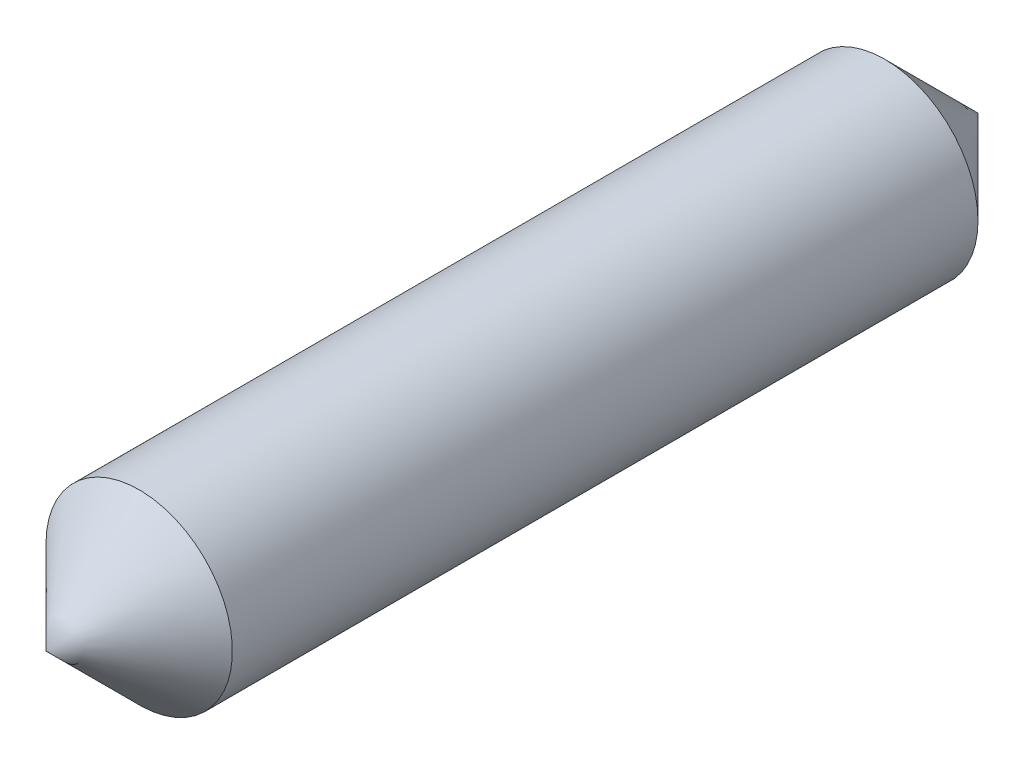
ISO-10303-21;
HEADER;
FILE_DESCRIPTION(('STEP AP214'),'2;1');
FILE_NAME('part.step','',(''),(''),'','','');
FILE_SCHEMA(('AUTOMOTIVE_DESIGN { 1 0 10303 214 1 1 1 1 }'));
ENDSEC;
DATA;
#1=APPLICATION_CONTEXT('core data for automotive mechanical design processes');
#2=APPLICATION_PROTOCOL_DEFINITION('international standard','automotive_design',2000,#1);
#3=PRODUCT_CONTEXT('',#1,'mechanical');
#4=PRODUCT('Part','Part','',(#3));
#5=PRODUCT_RELATED_PRODUCT_CATEGORY('part','',(#4));
#6=PRODUCT_DEFINITION_FORMATION('','',#4);
#7=PRODUCT_DEFINITION_CONTEXT('part definition',#1,'design');
#8=PRODUCT_DEFINITION('design','',#6,#7);
#9=PRODUCT_DEFINITION_SHAPE('','',#8);
#10=(LENGTH_UNIT() NAMED_UNIT(*) SI_UNIT(.MILLI.,.METRE.));
#11=(NAMED_UNIT(*) PLANE_ANGLE_UNIT() SI_UNIT($,.RADIAN.));
#12=(NAMED_UNIT(*) SI_UNIT($,.STERADIAN.) SOLID_ANGLE_UNIT());
#13=UNCERTAINTY_MEASURE_WITH_UNIT(LENGTH_MEASURE(1.E-05),#10,'distance_accuracy_value','');
#14=(GEOMETRIC_REPRESENTATION_CONTEXT(3) GLOBAL_UNCERTAINTY_ASSIGNED_CONTEXT((#13)) GLOBAL_UNIT_ASSIGNED_CONTEXT((#10,
#11,#12)) REPRESENTATION_CONTEXT('',''));
#15=CARTESIAN_POINT('',(0.,0.,0.));
#16=DIRECTION('',(0.,0.,1.));
#17=DIRECTION('',(1.,0.,0.));
#18=AXIS2_PLACEMENT_3D('',#15,#16,#17);
#19=CARTESIAN_POINT('',(0.,0.,50.));
#20=DIRECTION('',(0.,0.,-1.));
#21=DIRECTION('',(-1.,0.,0.));
#22=AXIS2_PLACEMENT_3D('',#19,#20,#21);
#23=CONICAL_SURFACE('',#22,0.,0.785398163397449);
#24=CARTESIAN_POINT('',(0.,0.,40.));
#25=DIRECTION('',(0.,0.,-1.));
#26=DIRECTION('',(-1.,0.,0.));
#27=AXIS2_PLACEMENT_3D('',#24,#25,#26);
#28=CIRCLE('',#27,10.);
#29=CARTESIAN_POINT('',(-10.,0.,40.));
#30=VERTEX_POINT('',#29);
#31=EDGE_CURVE('E47',#30,#30,#28,.T.);
#32=ORIENTED_EDGE('',*,*,#31,.F.);
#33=EDGE_LOOP('',(#32));
#34=FACE_BOUND('',#33,.T.);
#35=CARTESIAN_POINT('',(0.,0.,50.));
#36=VERTEX_POINT('',#35);
#37=VERTEX_LOOP('',#36);
#38=FACE_BOUND('',#37,.T.);
#39=ADVANCED_FACE('F39',(#34,#38),#23,.T.);
#40=CARTESIAN_POINT('',(0.,0.,-40.));
#41=DIRECTION('',(0.,0.,1.));
#42=DIRECTION('',(1.,0.,0.));
#43=AXIS2_PLACEMENT_3D('',#40,#41,#42);
#44=CONICAL_SURFACE('',#43,10.,0.785398163397448);
#45=CARTESIAN_POINT('',(0.,0.,-50.));
#46=VERTEX_POINT('',#45);
#47=VERTEX_LOOP('',#46);
#48=FACE_BOUND('',#47,.T.);
#49=CARTESIAN_POINT('',(0.,0.,-40.));
#50=DIRECTION('',(0.,0.,-1.));
#51=DIRECTION('',(-1.,0.,0.));
#52=AXIS2_PLACEMENT_3D('',#49,#50,#51);
#53=CIRCLE('',#52,10.);
#54=CARTESIAN_POINT('',(-10.,0.,-40.));
#55=VERTEX_POINT('',#54);
#56=EDGE_CURVE('E11',#55,#55,#53,.T.);
#57=ORIENTED_EDGE('',*,*,#56,.T.);
#58=EDGE_LOOP('',(#57));
#59=FACE_BOUND('',#58,.T.);
#60=ADVANCED_FACE('F53',(#48,#59),#44,.T.);
#61=CARTESIAN_POINT('',(0.,0.,-50.));
#62=DIRECTION('',(0.,0.,-1.));
#63=DIRECTION('',(-1.,0.,0.));
#64=AXIS2_PLACEMENT_3D('',#61,#62,#63);
#65=CYLINDRICAL_SURFACE('',#64,10.);
#66=ORIENTED_EDGE('',*,*,#56,.F.);
#67=EDGE_LOOP('',(#66));
#68=FACE_BOUND('',#67,.T.);
#69=ORIENTED_EDGE('',*,*,#31,.T.);
#70=EDGE_LOOP('',(#69));
#71=FACE_BOUND('',#70,.T.);
#72=ADVANCED_FACE('F56',(#68,#71),#65,.T.);
#73=CLOSED_SHELL('',(#39,#60,#72));
#74=MANIFOLD_SOLID_BREP('B2',#73);
#75=ADVANCED_BREP_SHAPE_REPRESENTATION('',(#18,#74),#14);
#76=SHAPE_DEFINITION_REPRESENTATION(#9,#75);
ENDSEC;
END-ISO-10303-21;
